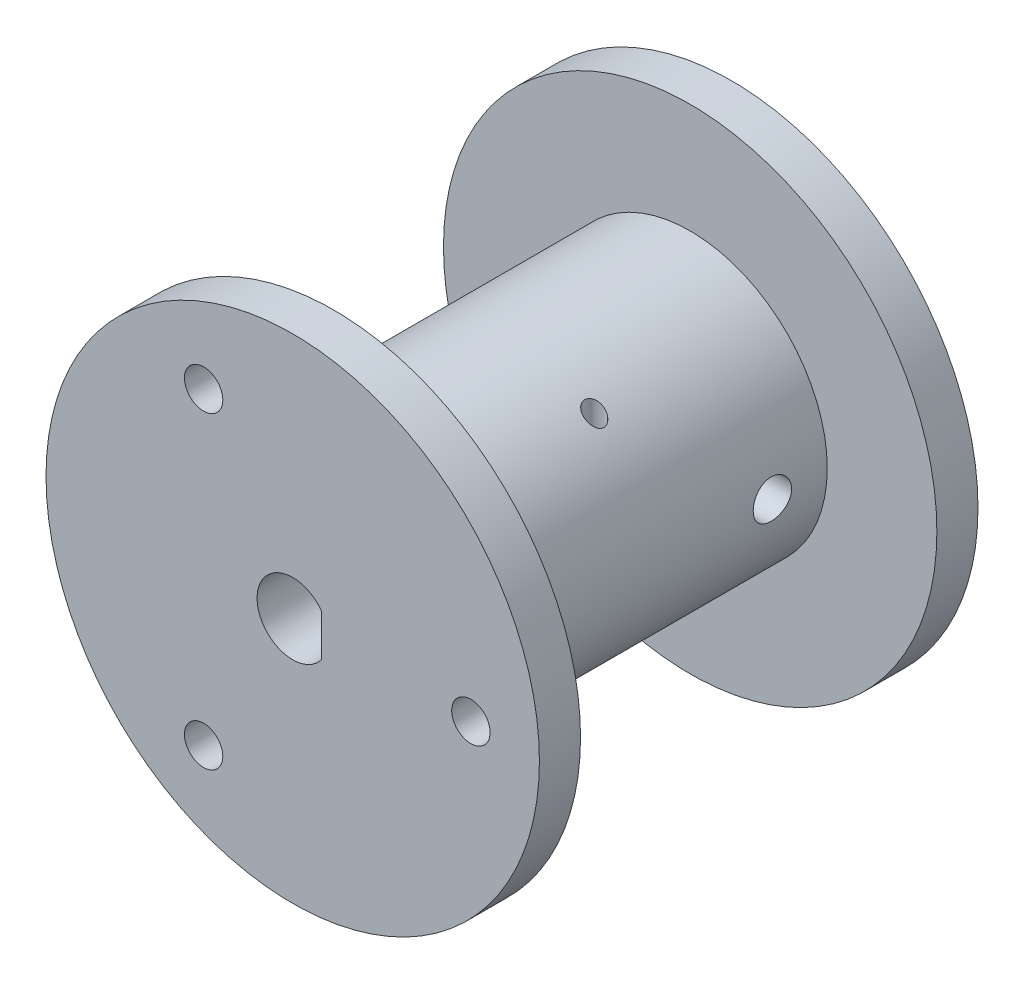
ISO-10303-21;
HEADER;
FILE_DESCRIPTION(('STEP AP214'),'2;1');
FILE_NAME('part.step','',(''),(''),'','','');
FILE_SCHEMA(('AUTOMOTIVE_DESIGN { 1 0 10303 214 1 1 1 1 }'));
ENDSEC;
DATA;
#1=APPLICATION_CONTEXT('core data for automotive mechanical design processes');
#2=APPLICATION_PROTOCOL_DEFINITION('international standard','automotive_design',2000,#1);
#3=PRODUCT_CONTEXT('',#1,'mechanical');
#4=PRODUCT('Part','Part','',(#3));
#5=PRODUCT_RELATED_PRODUCT_CATEGORY('part','',(#4));
#6=PRODUCT_DEFINITION_FORMATION('','',#4);
#7=PRODUCT_DEFINITION_CONTEXT('part definition',#1,'design');
#8=PRODUCT_DEFINITION('design','',#6,#7);
#9=PRODUCT_DEFINITION_SHAPE('','',#8);
#10=(LENGTH_UNIT() NAMED_UNIT(*) SI_UNIT(.MILLI.,.METRE.));
#11=(NAMED_UNIT(*) PLANE_ANGLE_UNIT() SI_UNIT($,.RADIAN.));
#12=(NAMED_UNIT(*) SI_UNIT($,.STERADIAN.) SOLID_ANGLE_UNIT());
#13=UNCERTAINTY_MEASURE_WITH_UNIT(LENGTH_MEASURE(1.E-05),#10,'distance_accuracy_value','');
#14=(GEOMETRIC_REPRESENTATION_CONTEXT(3) GLOBAL_UNCERTAINTY_ASSIGNED_CONTEXT((#13)) GLOBAL_UNIT_ASSIGNED_CONTEXT((#10,
#11,#12)) REPRESENTATION_CONTEXT('',''));
#15=CARTESIAN_POINT('',(0.,0.,0.));
#16=DIRECTION('',(0.,0.,1.));
#17=DIRECTION('',(1.,0.,0.));
#18=AXIS2_PLACEMENT_3D('',#15,#16,#17);
#19=CARTESIAN_POINT('',(0.,0.,0.));
#20=DIRECTION('',(0.,0.,-1.));
#21=DIRECTION('',(1.,0.,0.));
#22=AXIS2_PLACEMENT_3D('',#19,#20,#21);
#23=CYLINDRICAL_SURFACE('',#22,18.);
#24=CARTESIAN_POINT('',(0.,0.,0.));
#25=DIRECTION('',(0.,0.,1.));
#26=DIRECTION('',(1.,0.,0.));
#27=AXIS2_PLACEMENT_3D('',#24,#25,#26);
#28=CIRCLE('',#27,18.);
#29=CARTESIAN_POINT('',(18.,0.,0.));
#30=VERTEX_POINT('',#29);
#31=EDGE_CURVE('E24',#30,#30,#28,.T.);
#32=ORIENTED_EDGE('',*,*,#31,.T.);
#33=DIRECTION('',(0.,0.,1.));
#34=VECTOR('',#33,1.);
#35=CARTESIAN_POINT('',(18.,0.,0.));
#36=LINE('',#35,#34);
#37=CARTESIAN_POINT('',(18.,0.,3.));
#38=VERTEX_POINT('',#37);
#39=EDGE_CURVE('E10',#30,#38,#36,.T.);
#40=ORIENTED_EDGE('',*,*,#39,.T.);
#41=CARTESIAN_POINT('',(0.,0.,3.));
#42=DIRECTION('',(0.,0.,1.));
#43=DIRECTION('',(1.,0.,0.));
#44=AXIS2_PLACEMENT_3D('',#41,#42,#43);
#45=CIRCLE('',#44,18.);
#46=EDGE_CURVE('E242',#38,#38,#45,.T.);
#47=ORIENTED_EDGE('',*,*,#46,.F.);
#48=ORIENTED_EDGE('',*,*,#39,.F.);
#49=EDGE_LOOP('',(#32,#40,#47,#48));
#50=FACE_BOUND('',#49,.T.);
#51=ADVANCED_FACE('F16',(#50),#23,.T.);
#52=CARTESIAN_POINT('',(-6.5,11.258330249198,29.15));
#53=DIRECTION('',(0.,0.,1.));
#54=DIRECTION('',(1.,0.,0.));
#55=AXIS2_PLACEMENT_3D('',#52,#53,#54);
#56=PLANE('',#55);
#57=CARTESIAN_POINT('',(-6.5,11.258330249198,29.15));
#58=DIRECTION('',(0.,0.,1.));
#59=DIRECTION('',(1.,0.,0.));
#60=AXIS2_PLACEMENT_3D('',#57,#58,#59);
#61=CIRCLE('',#60,1.4);
#62=CARTESIAN_POINT('',(-5.1,11.258330249198,29.15));
#63=VERTEX_POINT('',#62);
#64=EDGE_CURVE('E236',#63,#63,#61,.T.);
#65=ORIENTED_EDGE('',*,*,#64,.T.);
#66=EDGE_LOOP('',(#65));
#67=FACE_BOUND('',#66,.T.);
#68=ADVANCED_FACE('F264',(#67),#56,.T.);
#69=CARTESIAN_POINT('',(13.,0.,29.15));
#70=DIRECTION('',(0.,0.,1.));
#71=DIRECTION('',(1.,0.,0.));
#72=AXIS2_PLACEMENT_3D('',#69,#70,#71);
#73=PLANE('',#72);
#74=CARTESIAN_POINT('',(13.,0.,29.15));
#75=DIRECTION('',(0.,0.,1.));
#76=DIRECTION('',(1.,0.,0.));
#77=AXIS2_PLACEMENT_3D('',#74,#75,#76);
#78=CIRCLE('',#77,1.4);
#79=CARTESIAN_POINT('',(14.4,0.,29.15));
#80=VERTEX_POINT('',#79);
#81=EDGE_CURVE('E232',#80,#80,#78,.T.);
#82=ORIENTED_EDGE('',*,*,#81,.T.);
#83=EDGE_LOOP('',(#82));
#84=FACE_BOUND('',#83,.T.);
#85=ADVANCED_FACE('F254',(#84),#73,.T.);
#86=CARTESIAN_POINT('',(0.,0.,0.));
#87=DIRECTION('',(0.,0.,1.));
#88=DIRECTION('',(1.,0.,0.));
#89=AXIS2_PLACEMENT_3D('',#86,#87,#88);
#90=PLANE('',#89);
#91=CARTESIAN_POINT('',(0.,0.,0.));
#92=DIRECTION('',(0.,0.,-1.));
#93=DIRECTION('',(1.,0.,0.));
#94=AXIS2_PLACEMENT_3D('',#91,#92,#93);
#95=CIRCLE('',#94,2.6);
#96=CARTESIAN_POINT('',(2.1,-1.532970971676,0.));
#97=VERTEX_POINT('',#96);
#98=CARTESIAN_POINT('',(2.1,1.532970971676,0.));
#99=VERTEX_POINT('',#98);
#100=EDGE_CURVE('E147',#97,#99,#95,.T.);
#101=ORIENTED_EDGE('',*,*,#100,.F.);
#102=DIRECTION('',(0.,1.,0.));
#103=VECTOR('',#102,1.);
#104=CARTESIAN_POINT('',(2.1,-1.3,0.));
#105=LINE('',#104,#103);
#106=EDGE_CURVE('E218',#97,#99,#105,.T.);
#107=ORIENTED_EDGE('',*,*,#106,.T.);
#108=EDGE_LOOP('',(#101,#107));
#109=FACE_BOUND('',#108,.T.);
#110=ORIENTED_EDGE('',*,*,#31,.F.);
#111=EDGE_LOOP('',(#110));
#112=FACE_BOUND('',#111,.T.);
#113=ADVANCED_FACE('F252',(#109,#112),#90,.F.);
#114=CARTESIAN_POINT('',(-6.5,-11.25833024919,29.15));
#115=DIRECTION('',(0.,0.,1.));
#116=DIRECTION('',(1.,0.,0.));
#117=AXIS2_PLACEMENT_3D('',#114,#115,#116);
#118=PLANE('',#117);
#119=CARTESIAN_POINT('',(-6.5,-11.25833024919,29.15));
#120=DIRECTION('',(0.,0.,1.));
#121=DIRECTION('',(1.,0.,0.));
#122=AXIS2_PLACEMENT_3D('',#119,#120,#121);
#123=CIRCLE('',#122,1.4);
#124=CARTESIAN_POINT('',(-5.1,-11.25833024919,29.15));
#125=VERTEX_POINT('',#124);
#126=EDGE_CURVE('E215',#125,#125,#123,.T.);
#127=ORIENTED_EDGE('',*,*,#126,.T.);
#128=EDGE_LOOP('',(#127));
#129=FACE_BOUND('',#128,.T.);
#130=ADVANCED_FACE('F255',(#129),#118,.T.);
#131=CARTESIAN_POINT('',(6.,20.,16.));
#132=DIRECTION('',(0.,1.,0.));
#133=DIRECTION('',(1.,0.,0.));
#134=AXIS2_PLACEMENT_3D('',#131,#132,#133);
#135=CYLINDRICAL_SURFACE('',#134,0.7);
#136=CARTESIAN_POINT('',(6.7,7.423610981187,16.));
#137=CARTESIAN_POINT('',(6.7,7.423610981187,16.061420163176));
#138=CARTESIAN_POINT('',(6.693532975308,7.429447600473,16.122754671505));
#139=CARTESIAN_POINT('',(6.680632709645,7.441090597171,16.183098192978));
#140=CARTESIAN_POINT('',(6.661520256542,7.458262973313,16.24155588298));
#141=CARTESIAN_POINT('',(6.636601886671,7.480449371539,16.297273795192));
#142=CARTESIAN_POINT('',(6.595796443133,7.516360339853,16.368085013772));
#143=CARTESIAN_POINT('',(6.584424511656,7.526335762921,16.386239650214));
#144=CARTESIAN_POINT('',(6.572411678957,7.53683522499,16.403938417637));
#145=CARTESIAN_POINT('',(6.559781217614,7.547830749187,16.421155499173));
#146=CARTESIAN_POINT('',(6.546556959473,7.559293875357,16.437867222008));
#147=CARTESIAN_POINT('',(6.501960020964,7.597774091174,16.490195168881));
#148=CARTESIAN_POINT('',(6.46832721929,7.626531666773,16.523698047556));
#149=CARTESIAN_POINT('',(6.432123449108,7.657158813957,16.554339959049));
#150=CARTESIAN_POINT('',(6.393617223354,7.689342566472,16.581920111358));
#151=CARTESIAN_POINT('',(6.353091890638,7.722770795535,16.606257993675));
#152=CARTESIAN_POINT('',(6.258811586842,7.799472927624,16.652985313187));
#153=CARTESIAN_POINT('',(6.20411790761,7.843273272387,16.673638278514));
#154=CARTESIAN_POINT('',(6.147355183932,7.887943549649,16.688823903646));
#155=CARTESIAN_POINT('',(6.089143902674,7.932913952525,16.698287434595));
#156=CARTESIAN_POINT('',(6.030139770779,7.977646487715,16.701848317146));
#157=CARTESIAN_POINT('',(5.91087005233,8.066426752755,16.696908731573));
#158=CARTESIAN_POINT('',(5.850590582323,8.110455682424,16.688190677623));
#159=CARTESIAN_POINT('',(5.791081437799,8.153082869391,16.673140201952));
#160=CARTESIAN_POINT('',(5.733238053439,8.193743142968,16.651837184436));
#161=CARTESIAN_POINT('',(5.677927203744,8.231955757717,16.624540370653));
#162=CARTESIAN_POINT('',(5.577504946575,8.300293496152,16.561054925864));
#163=CARTESIAN_POINT('',(5.532003137056,8.330759241346,16.525627389309));
#164=CARTESIAN_POINT('',(5.490076266743,8.358416380811,16.485764177875));
#165=CARTESIAN_POINT('',(5.452291438685,8.383027386573,16.44195216543));
#166=CARTESIAN_POINT('',(5.419118280647,8.404420250563,16.394785949125));
#167=CARTESIAN_POINT('',(5.36129132756,8.441432989465,16.292678361777));
#168=CARTESIAN_POINT('',(5.33712915028,8.456721903805,16.23745857878));
#169=CARTESIAN_POINT('',(5.318744644311,8.468260971439,16.17997836171));
#170=CARTESIAN_POINT('',(5.306370909869,8.475994277313,16.120973813692));
#171=CARTESIAN_POINT('',(5.300126506963,8.479897347958,16.061211317834));
#172=CARTESIAN_POINT('',(5.299916523227,8.480028588211,15.960824351901));
#173=CARTESIAN_POINT('',(5.302662862186,8.47831208954,15.920174360154));
#174=CARTESIAN_POINT('',(5.308241963266,8.47482539965,15.87975351697));
#175=CARTESIAN_POINT('',(5.316630550833,8.46957309751,15.839798604194));
#176=CARTESIAN_POINT('',(5.327781638656,8.462565271847,15.800542407666));
#177=CARTESIAN_POINT('',(5.348599341269,8.449411407784,15.742903432129));
#178=CARTESIAN_POINT('',(5.356256004786,8.444563830289,15.723830876313));
#179=CARTESIAN_POINT('',(5.364586161912,8.439277434952,15.705024505533));
#180=CARTESIAN_POINT('',(5.37357854278,8.433555290088,15.686513974385));
#181=CARTESIAN_POINT('',(5.383219946253,8.427401254546,15.668328633745));
#182=CARTESIAN_POINT('',(5.421832205693,8.402670285586,15.601323329893));
#183=CARTESIAN_POINT('',(5.455012481143,8.381257029193,15.554804335829));
#184=CARTESIAN_POINT('',(5.492698816365,8.356691629017,15.511609025122));
#185=CARTESIAN_POINT('',(5.534430085028,8.329144046304,15.472313228275));
#186=CARTESIAN_POINT('',(5.579651521336,8.298847750574,15.437388068836));
#187=CARTESIAN_POINT('',(5.662585482144,8.242384495224,15.385309871925));
#188=CARTESIAN_POINT('',(5.698917998809,8.217390657414,15.365921049236));
#189=CARTESIAN_POINT('',(5.736500157893,8.191243269006,15.349154633775));
#190=CARTESIAN_POINT('',(5.775073989581,8.16408094826,15.335107466314));
#191=CARTESIAN_POINT('',(5.814371790981,8.136060754353,15.323838787263));
#192=CARTESIAN_POINT('',(5.931768447205,8.051291543394,15.29882445447));
#193=CARTESIAN_POINT('',(6.010993571128,7.992727375067,15.292990488834));
#194=CARTESIAN_POINT('',(6.090088070553,7.932754295285,15.297873697529));
#195=CARTESIAN_POINT('',(6.167391253484,7.872608031572,15.313195901262));
#196=CARTESIAN_POINT('',(6.241346146774,7.813677462955,15.338400572407));
#197=CARTESIAN_POINT('',(6.352184245195,7.723511933627,15.393266956371));
#198=CARTESIAN_POINT('',(6.392158095265,7.690547999272,15.417183943095));
#199=CARTESIAN_POINT('',(6.43017645922,7.658787058651,15.444252795814));
#200=CARTESIAN_POINT('',(6.465968124576,7.628527498068,15.474301287601));
#201=CARTESIAN_POINT('',(6.499275765808,7.600068704935,15.507138139574));
#202=CARTESIAN_POINT('',(6.543922714996,7.561575278007,15.558851812687));
#203=CARTESIAN_POINT('',(6.557413401678,7.549889225285,15.575693913783));
#204=CARTESIAN_POINT('',(6.570298101718,7.538679103142,15.59305743974));
#205=CARTESIAN_POINT('',(6.582552014467,7.527974507574,15.610917990655));
#206=CARTESIAN_POINT('',(6.594150908199,7.517804555788,15.629248931725));
#207=CARTESIAN_POINT('',(6.635614063146,7.481328814013,15.700526438729));
#208=CARTESIAN_POINT('',(6.66091413908,7.458807533322,15.756597917506));
#209=CARTESIAN_POINT('',(6.680325568549,7.441367808296,15.81547174188));
#210=CARTESIAN_POINT('',(6.693430112146,7.429540434902,15.876275215474));
#211=CARTESIAN_POINT('',(6.7,7.423610981187,15.938093293157));
#212=CARTESIAN_POINT('',(6.7,7.423610981187,16.));
#213=(BOUNDED_CURVE() B_SPLINE_CURVE(6,(#136,#137,#138,#139,#140,#141,#142,#143,#144,#145,#146,
#147,#148,#149,#150,#151,#152,#153,#154,#155,#156,#157,#158,#159,#160,#161,#162,#163,#164,#165,
#166,#167,#168,#169,#170,#171,#172,#173,#174,#175,#176,#177,#178,#179,#180,#181,#182,#183,#184,
#185,#186,#187,#188,#189,#190,#191,#192,#193,#194,#195,#196,#197,#198,#199,#200,#201,#202,#203,
#204,#205,#206,#207,#208,#209,#210,#211,#212),.UNSPECIFIED.,.T.,
.F.) B_SPLINE_CURVE_WITH_KNOTS((7,5,5,5,5,5,5,5,5,5,5,5,5,5,5,7),(0.,0.08286151673284,
0.112342981733,0.178179417654,0.259286098524,0.341845266376,0.418789774287,0.499511354963,
0.554418021429,0.582077179904,0.658354963559,0.713613191653,0.821552318296,0.886504016402,
0.91639562001,1.),
.UNSPECIFIED.) CURVE() GEOMETRIC_REPRESENTATION_ITEM() RATIONAL_B_SPLINE_CURVE((1.,1.,1.,1.,1.,
1.,1.,1.,1.,1.,1.,1.,1.,1.,1.,1.,1.,1.,1.,1.,1.,1.,1.,1.,1.,1.,1.,1.,1.,1.,1.,1.,1.,1.,1.,1.,1.,
1.,1.,1.,1.,1.,1.,1.,1.,1.,1.,1.,1.,1.,1.,1.,1.,1.,1.,1.,1.,1.,1.,1.,1.,1.,1.,1.,1.,1.,1.,1.,1.,
1.,1.,1.,1.,1.,1.,1.,1.)) REPRESENTATION_ITEM(''));
#214=CARTESIAN_POINT('',(6.7,7.423610981187,16.));
#215=VERTEX_POINT('',#214);
#216=EDGE_CURVE('E138',#215,#215,#213,.T.);
#217=ORIENTED_EDGE('',*,*,#216,.F.);
#218=DIRECTION('',(0.,-1.,0.));
#219=VECTOR('',#218,1.);
#220=CARTESIAN_POINT('',(6.7,20.,16.));
#221=LINE('',#220,#219);
#222=CARTESIAN_POINT('',(6.7,-7.423610981187,16.));
#223=VERTEX_POINT('',#222);
#224=EDGE_CURVE('E246',#215,#223,#221,.T.);
#225=ORIENTED_EDGE('',*,*,#224,.T.);
#226=CARTESIAN_POINT('',(6.7,-7.423610981187,16.));
#227=CARTESIAN_POINT('',(6.7,-7.423610981187,16.061420163176));
#228=CARTESIAN_POINT('',(6.693532975308,-7.429447600473,16.122754671505));
#229=CARTESIAN_POINT('',(6.680632709645,-7.441090597171,16.183098192978));
#230=CARTESIAN_POINT('',(6.661520256542,-7.458262973313,16.24155588298));
#231=CARTESIAN_POINT('',(6.636601886671,-7.480449371539,16.297273795192));
#232=CARTESIAN_POINT('',(6.595796443133,-7.516360339853,16.368085013772));
#233=CARTESIAN_POINT('',(6.584424511656,-7.526335762921,16.386239650214));
#234=CARTESIAN_POINT('',(6.572411678957,-7.53683522499,16.403938417637));
#235=CARTESIAN_POINT('',(6.559781217614,-7.547830749187,16.421155499173));
#236=CARTESIAN_POINT('',(6.546556959473,-7.559293875357,16.437867222008));
#237=CARTESIAN_POINT('',(6.501960020964,-7.597774091174,16.490195168881));
#238=CARTESIAN_POINT('',(6.46832721929,-7.626531666773,16.523698047556));
#239=CARTESIAN_POINT('',(6.432123449108,-7.657158813957,16.554339959049));
#240=CARTESIAN_POINT('',(6.393617223354,-7.689342566472,16.581920111358));
#241=CARTESIAN_POINT('',(6.353091890638,-7.722770795535,16.606257993675));
#242=CARTESIAN_POINT('',(6.258811586842,-7.799472927624,16.652985313187));
#243=CARTESIAN_POINT('',(6.20411790761,-7.843273272387,16.673638278514));
#244=CARTESIAN_POINT('',(6.147355183932,-7.887943549649,16.688823903646));
#245=CARTESIAN_POINT('',(6.089143902674,-7.932913952525,16.698287434595));
#246=CARTESIAN_POINT('',(6.030139770779,-7.977646487715,16.701848317146));
#247=CARTESIAN_POINT('',(5.91087005233,-8.066426752755,16.696908731573));
#248=CARTESIAN_POINT('',(5.850590582323,-8.110455682424,16.688190677623));
#249=CARTESIAN_POINT('',(5.791081437799,-8.153082869391,16.673140201952));
#250=CARTESIAN_POINT('',(5.733238053439,-8.193743142968,16.651837184436));
#251=CARTESIAN_POINT('',(5.677927203744,-8.231955757717,16.624540370653));
#252=CARTESIAN_POINT('',(5.577504946575,-8.300293496152,16.561054925864));
#253=CARTESIAN_POINT('',(5.532003137056,-8.330759241346,16.525627389309));
#254=CARTESIAN_POINT('',(5.490076266743,-8.358416380811,16.485764177875));
#255=CARTESIAN_POINT('',(5.452291438685,-8.383027386573,16.44195216543));
#256=CARTESIAN_POINT('',(5.419118280647,-8.404420250563,16.394785949125));
#257=CARTESIAN_POINT('',(5.36129132756,-8.441432989465,16.292678361777));
#258=CARTESIAN_POINT('',(5.33712915028,-8.456721903805,16.23745857878));
#259=CARTESIAN_POINT('',(5.318744644311,-8.468260971439,16.17997836171));
#260=CARTESIAN_POINT('',(5.306370909869,-8.475994277313,16.120973813692));
#261=CARTESIAN_POINT('',(5.300126506963,-8.479897347958,16.061211317834));
#262=CARTESIAN_POINT('',(5.299916523227,-8.480028588211,15.960824351901));
#263=CARTESIAN_POINT('',(5.302662862186,-8.47831208954,15.920174360154));
#264=CARTESIAN_POINT('',(5.308241963266,-8.47482539965,15.87975351697));
#265=CARTESIAN_POINT('',(5.316630550833,-8.46957309751,15.839798604194));
#266=CARTESIAN_POINT('',(5.327781638656,-8.462565271847,15.800542407666));
#267=CARTESIAN_POINT('',(5.348599341269,-8.449411407784,15.742903432129));
#268=CARTESIAN_POINT('',(5.356256004786,-8.444563830289,15.723830876313));
#269=CARTESIAN_POINT('',(5.364586161912,-8.439277434952,15.705024505533));
#270=CARTESIAN_POINT('',(5.37357854278,-8.433555290088,15.686513974385));
#271=CARTESIAN_POINT('',(5.383219946253,-8.427401254546,15.668328633745));
#272=CARTESIAN_POINT('',(5.421832205693,-8.402670285586,15.601323329893));
#273=CARTESIAN_POINT('',(5.455012481143,-8.381257029193,15.554804335829));
#274=CARTESIAN_POINT('',(5.492698816365,-8.356691629017,15.511609025122));
#275=CARTESIAN_POINT('',(5.534430085028,-8.329144046304,15.472313228275));
#276=CARTESIAN_POINT('',(5.579651521336,-8.298847750574,15.437388068836));
#277=CARTESIAN_POINT('',(5.662585482144,-8.242384495224,15.385309871925));
#278=CARTESIAN_POINT('',(5.698917998809,-8.217390657414,15.365921049236));
#279=CARTESIAN_POINT('',(5.736500157893,-8.191243269006,15.349154633775));
#280=CARTESIAN_POINT('',(5.775073989581,-8.16408094826,15.335107466314));
#281=CARTESIAN_POINT('',(5.814371790981,-8.136060754353,15.323838787263));
#282=CARTESIAN_POINT('',(5.931768447205,-8.051291543394,15.29882445447));
#283=CARTESIAN_POINT('',(6.010993571128,-7.992727375068,15.292990488834));
#284=CARTESIAN_POINT('',(6.090088070553,-7.932754295284,15.297873697529));
#285=CARTESIAN_POINT('',(6.167391253484,-7.872608031572,15.313195901261));
#286=CARTESIAN_POINT('',(6.241346146774,-7.813677462955,15.338400572407));
#287=CARTESIAN_POINT('',(6.352184245195,-7.723511933627,15.393266956371));
#288=CARTESIAN_POINT('',(6.392158095265,-7.690547999272,15.417183943095));
#289=CARTESIAN_POINT('',(6.43017645922,-7.658787058651,15.444252795814));
#290=CARTESIAN_POINT('',(6.465968124576,-7.628527498068,15.474301287601));
#291=CARTESIAN_POINT('',(6.499275765807,-7.600068704935,15.507138139574));
#292=CARTESIAN_POINT('',(6.543922714996,-7.561575278007,15.558851812687));
#293=CARTESIAN_POINT('',(6.557413401678,-7.549889225285,15.575693913783));
#294=CARTESIAN_POINT('',(6.570298101718,-7.538679103142,15.59305743974));
#295=CARTESIAN_POINT('',(6.582552014467,-7.527974507574,15.610917990655));
#296=CARTESIAN_POINT('',(6.594150908199,-7.517804555788,15.629248931725));
#297=CARTESIAN_POINT('',(6.635614063147,-7.481328814013,15.700526438729));
#298=CARTESIAN_POINT('',(6.66091413908,-7.458807533322,15.756597917506));
#299=CARTESIAN_POINT('',(6.68032556855,-7.441367808296,15.81547174188));
#300=CARTESIAN_POINT('',(6.693430112146,-7.429540434902,15.876275215473));
#301=CARTESIAN_POINT('',(6.7,-7.423610981187,15.938093293157));
#302=CARTESIAN_POINT('',(6.7,-7.423610981187,16.));
#303=(BOUNDED_CURVE() B_SPLINE_CURVE(6,(#226,#227,#228,#229,#230,#231,#232,#233,#234,#235,#236,
#237,#238,#239,#240,#241,#242,#243,#244,#245,#246,#247,#248,#249,#250,#251,#252,#253,#254,#255,
#256,#257,#258,#259,#260,#261,#262,#263,#264,#265,#266,#267,#268,#269,#270,#271,#272,#273,#274,
#275,#276,#277,#278,#279,#280,#281,#282,#283,#284,#285,#286,#287,#288,#289,#290,#291,#292,#293,
#294,#295,#296,#297,#298,#299,#300,#301,#302),.UNSPECIFIED.,.T.,
.F.) B_SPLINE_CURVE_WITH_KNOTS((7,5,5,5,5,5,5,5,5,5,5,5,5,5,5,7),(0.,0.08286151673284,
0.112342981733,0.178179417654,0.259286098524,0.341845266376,0.418789774287,0.499511354963,
0.554418021429,0.582077179904,0.658354963559,0.713613191653,0.821552318295,0.886504016402,
0.91639562001,1.),
.UNSPECIFIED.) CURVE() GEOMETRIC_REPRESENTATION_ITEM() RATIONAL_B_SPLINE_CURVE((1.,1.,1.,1.,1.,
1.,1.,1.,1.,1.,1.,1.,1.,1.,1.,1.,1.,1.,1.,1.,1.,1.,1.,1.,1.,1.,1.,1.,1.,1.,1.,1.,1.,1.,1.,1.,1.,
1.,1.,1.,1.,1.,1.,1.,1.,1.,1.,1.,1.,1.,1.,1.,1.,1.,1.,1.,1.,1.,1.,1.,1.,1.,1.,1.,1.,1.,1.,1.,1.,
1.,1.,1.,1.,1.,1.,1.,1.)) REPRESENTATION_ITEM(''));
#304=EDGE_CURVE('E199',#223,#223,#303,.T.);
#305=ORIENTED_EDGE('',*,*,#304,.T.);
#306=ORIENTED_EDGE('',*,*,#224,.F.);
#307=EDGE_LOOP('',(#217,#225,#305,#306));
#308=FACE_BOUND('',#307,.T.);
#309=ADVANCED_FACE('F263',(#308),#135,.F.);
#310=CARTESIAN_POINT('',(0.,0.,3.));
#311=DIRECTION('',(0.,0.,1.));
#312=DIRECTION('',(1.,0.,0.));
#313=AXIS2_PLACEMENT_3D('',#310,#311,#312);
#314=PLANE('',#313);
#315=CARTESIAN_POINT('',(0.,0.,3.));
#316=DIRECTION('',(0.,0.,1.));
#317=DIRECTION('',(1.,0.,0.));
#318=AXIS2_PLACEMENT_3D('',#315,#316,#317);
#319=CIRCLE('',#318,10.);
#320=CARTESIAN_POINT('',(10.,0.,3.));
#321=VERTEX_POINT('',#320);
#322=EDGE_CURVE('E142',#321,#321,#319,.T.);
#323=ORIENTED_EDGE('',*,*,#322,.F.);
#324=EDGE_LOOP('',(#323));
#325=FACE_BOUND('',#324,.T.);
#326=ORIENTED_EDGE('',*,*,#46,.T.);
#327=EDGE_LOOP('',(#326));
#328=FACE_BOUND('',#327,.T.);
#329=ADVANCED_FACE('F281',(#325,#328),#314,.T.);
#330=CARTESIAN_POINT('',(1.5,0.,7.));
#331=DIRECTION('',(-1.,0.,0.));
#332=DIRECTION('',(0.,1.,0.));
#333=AXIS2_PLACEMENT_3D('',#330,#331,#332);
#334=CYLINDRICAL_SURFACE('',#333,1.4);
#335=CARTESIAN_POINT('',(2.1,0.,7.));
#336=DIRECTION('',(-1.,0.,0.));
#337=DIRECTION('',(0.,1.,0.));
#338=AXIS2_PLACEMENT_3D('',#335,#336,#337);
#339=CIRCLE('',#338,1.4);
#340=CARTESIAN_POINT('',(2.1,1.4,7.));
#341=VERTEX_POINT('',#340);
#342=EDGE_CURVE('E148',#341,#341,#339,.T.);
#343=ORIENTED_EDGE('',*,*,#342,.T.);
#344=DIRECTION('',(1.,0.,0.));
#345=VECTOR('',#344,1.);
#346=CARTESIAN_POINT('',(1.5,1.4,7.));
#347=LINE('',#346,#345);
#348=CARTESIAN_POINT('',(9.901515035589,1.4,7.));
#349=VERTEX_POINT('',#348);
#350=EDGE_CURVE('E239',#341,#349,#347,.T.);
#351=ORIENTED_EDGE('',*,*,#350,.T.);
#352=CARTESIAN_POINT('',(9.901515035589,1.4,7.));
#353=CARTESIAN_POINT('',(9.901515035589,1.4,7.134298040237));
#354=CARTESIAN_POINT('',(9.903640130875,1.384970160413,7.268589139922));
#355=CARTESIAN_POINT('',(9.907890140904,1.354912335546,7.401660688283));
#356=CARTESIAN_POINT('',(9.914145916786,1.309630366842,7.532236162476));
#357=CARTESIAN_POINT('',(9.922162754959,1.248786389021,7.65884807891));
#358=CARTESIAN_POINT('',(9.931531765376,1.171952055942,7.779693624638));
#359=CARTESIAN_POINT('',(9.948179730155,1.018521665372,7.965159107079));
#360=CARTESIAN_POINT('',(9.955038071414,0.951348878908,8.034697429937));
#361=CARTESIAN_POINT('',(9.962042494822,0.877220953455,8.100112730271));
#362=CARTESIAN_POINT('',(9.968971917954,0.796263869732,8.160484738731));
#363=CARTESIAN_POINT('',(9.975572533991,0.708712220674,8.214865717801));
#364=CARTESIAN_POINT('',(9.981573511395,0.614919371267,8.262274427594));
#365=CARTESIAN_POINT('',(9.990223321868,0.4473069353,8.328636885616));
#366=CARTESIAN_POINT('',(9.993330588733,0.376585741878,8.351833805127));
#367=CARTESIAN_POINT('',(9.995933260826,0.303648928901,8.370847982723));
#368=CARTESIAN_POINT('',(9.997948600515,0.228986458656,8.385349327532));
#369=CARTESIAN_POINT('',(9.999315553896,0.153124780768,8.395108850329));
#370=CARTESIAN_POINT('',(10.,0.07661149265728,8.4));
#371=CARTESIAN_POINT('',(10.,0.,8.4));
#372=(BOUNDED_CURVE() B_SPLINE_CURVE(7,(#352,#353,#354,#355,#356,#357,#358,#359,#360,#361,#362,
#363,#364,#365,#366,#367,#368,#369,#370,#371),.UNSPECIFIED.,.F.,
.F.) B_SPLINE_CURVE_WITH_KNOTS((8,6,6,8),(0.,0.479122703375,0.788471642168,1.),
.UNSPECIFIED.) CURVE() GEOMETRIC_REPRESENTATION_ITEM() RATIONAL_B_SPLINE_CURVE((1.,1.,1.,1.,1.,
1.,1.,1.,1.,1.,1.,1.,1.,1.,1.,1.,1.,1.,1.,1.)) REPRESENTATION_ITEM(''));
#373=CARTESIAN_POINT('',(10.,0.,8.4));
#374=VERTEX_POINT('',#373);
#375=EDGE_CURVE('E163',#349,#374,#372,.T.);
#376=ORIENTED_EDGE('',*,*,#375,.T.);
#377=CARTESIAN_POINT('',(10.,0.,8.4));
#378=CARTESIAN_POINT('',(10.,-0.190635546012,8.4));
#379=CARTESIAN_POINT('',(9.99575997734,-0.376798379062,8.369715303774));
#380=CARTESIAN_POINT('',(9.987639043286,-0.552869533634,8.311702258982));
#381=CARTESIAN_POINT('',(9.976717520861,-0.714070276914,8.22966289985));
#382=CARTESIAN_POINT('',(9.96454544228,-0.856667749464,8.128392867031));
#383=CARTESIAN_POINT('',(9.952538717575,-0.978348518018,8.013720100293));
#384=CARTESIAN_POINT('',(9.931532089328,-1.171949070345,7.779697233605));
#385=CARTESIAN_POINT('',(9.922163217262,-1.24878272688,7.658854300596));
#386=CARTESIAN_POINT('',(9.914146162441,-1.309628935861,7.53224162339));
#387=CARTESIAN_POINT('',(9.90788989437,-1.354914097307,7.401660600399));
#388=CARTESIAN_POINT('',(9.903639753547,-1.384972827377,7.268580838195));
#389=CARTESIAN_POINT('',(9.901515035589,-1.4,7.134286087082));
#390=CARTESIAN_POINT('',(9.901515035589,-1.4,6.865701959763));
#391=CARTESIAN_POINT('',(9.903640130875,-1.384970160413,6.731410860078));
#392=CARTESIAN_POINT('',(9.907890140904,-1.354912335546,6.598339311717));
#393=CARTESIAN_POINT('',(9.914145916786,-1.309630366842,6.467763837523));
#394=CARTESIAN_POINT('',(9.922162754959,-1.248786389021,6.34115192109));
#395=CARTESIAN_POINT('',(9.931531765376,-1.171952055942,6.220306375362));
#396=CARTESIAN_POINT('',(9.952534945479,-0.978383282275,5.986321922475));
#397=CARTESIAN_POINT('',(9.964542600623,-0.85670155308,5.871625510799));
#398=CARTESIAN_POINT('',(9.97671905319,-0.714067881061,5.770319197342));
#399=CARTESIAN_POINT('',(9.987644027642,-0.552815610009,5.688262221335));
#400=CARTESIAN_POINT('',(9.995763498341,-0.376708006593,5.630259538256));
#401=CARTESIAN_POINT('',(10.,-0.190556349915,5.6));
#402=CARTESIAN_POINT('',(10.,0.,5.6));
#403=(BOUNDED_CURVE() B_SPLINE_CURVE(7,(#377,#378,#379,#380,#381,#382,#383,#384,#385,#386,#387,
#388,#389,#390,#391,#392,#393,#394,#395,#396,#397,#398,#399,#400,#401,#402),.UNSPECIFIED.,.F.,
.F.) B_SPLINE_CURVE_WITH_KNOTS((8,6,6,6,8),(0.,0.259233249005,0.500026793407,0.740841771471,1.),
.UNSPECIFIED.) CURVE() GEOMETRIC_REPRESENTATION_ITEM() RATIONAL_B_SPLINE_CURVE((1.,1.,1.,1.,1.,
1.,1.,1.,1.,1.,1.,1.,1.,1.,1.,1.,1.,1.,1.,1.,1.,1.,1.,1.,1.,1.)) REPRESENTATION_ITEM(''));
#404=CARTESIAN_POINT('',(10.,0.,5.6));
#405=VERTEX_POINT('',#404);
#406=EDGE_CURVE('E171',#374,#405,#403,.T.);
#407=ORIENTED_EDGE('',*,*,#406,.T.);
#408=CARTESIAN_POINT('',(10.,0.,5.6));
#409=CARTESIAN_POINT('',(10.,0.167747739612,5.6));
#410=CARTESIAN_POINT('',(9.996717003785,0.332690941998,5.623449316446));
#411=CARTESIAN_POINT('',(9.990349183427,0.490676962249,5.668937276187));
#412=CARTESIAN_POINT('',(9.981567826941,0.637973209536,5.734077348231));
#413=CARTESIAN_POINT('',(9.971407440037,0.77150280057,5.815565663907));
#414=CARTESIAN_POINT('',(9.960910095179,0.889121466665,5.909222479342));
#415=CARTESIAN_POINT('',(9.939012447563,1.109234564399,6.129335577076));
#416=CARTESIAN_POINT('',(9.927557193253,1.207446233009,6.261084542583));
#417=CARTESIAN_POINT('',(9.917530549097,1.28505205314,6.401412606408));
#418=CARTESIAN_POINT('',(9.909618525285,1.342689239539,6.547512855013));
#419=CARTESIAN_POINT('',(9.904216270258,1.380895184279,6.697185455819));
#420=CARTESIAN_POINT('',(9.901515035589,1.4,6.848586087001));
#421=CARTESIAN_POINT('',(9.901515035589,1.4,7.));
#422=(BOUNDED_CURVE() B_SPLINE_CURVE(7,(#408,#409,#410,#411,#412,#413,#414,#415,#416,#417,#418,
#419,#420,#421),.UNSPECIFIED.,.F.,.F.) B_SPLINE_CURVE_WITH_KNOTS((8,6,8),(0.,0.4580737268,1.),
.UNSPECIFIED.) CURVE() GEOMETRIC_REPRESENTATION_ITEM() RATIONAL_B_SPLINE_CURVE((1.,1.,1.,1.,1.,
1.,1.,1.,1.,1.,1.,1.,1.,1.)) REPRESENTATION_ITEM(''));
#423=EDGE_CURVE('E166',#405,#349,#422,.T.);
#424=ORIENTED_EDGE('',*,*,#423,.T.);
#425=ORIENTED_EDGE('',*,*,#350,.F.);
#426=EDGE_LOOP('',(#343,#351,#376,#407,#424,#425));
#427=FACE_BOUND('',#426,.T.);
#428=ADVANCED_FACE('F284',(#427),#334,.F.);
#429=CARTESIAN_POINT('',(-6.5,11.258330249198,29.15));
#430=DIRECTION('',(0.,0.,-1.));
#431=DIRECTION('',(1.,0.,0.));
#432=AXIS2_PLACEMENT_3D('',#429,#430,#431);
#433=CYLINDRICAL_SURFACE('',#432,1.4);
#434=DIRECTION('',(0.,0.,1.));
#435=VECTOR('',#434,1.);
#436=CARTESIAN_POINT('',(-5.1,11.258330249198,29.15));
#437=LINE('',#436,#435);
#438=CARTESIAN_POINT('',(-5.1,11.258330249198,32.));
#439=VERTEX_POINT('',#438);
#440=EDGE_CURVE('E231',#63,#439,#437,.T.);
#441=ORIENTED_EDGE('',*,*,#440,.T.);
#442=CARTESIAN_POINT('',(-6.5,11.258330249198,32.));
#443=DIRECTION('',(0.,0.,1.));
#444=DIRECTION('',(1.,0.,0.));
#445=AXIS2_PLACEMENT_3D('',#442,#443,#444);
#446=CIRCLE('',#445,1.4);
#447=EDGE_CURVE('E178',#439,#439,#446,.T.);
#448=ORIENTED_EDGE('',*,*,#447,.T.);
#449=ORIENTED_EDGE('',*,*,#440,.F.);
#450=ORIENTED_EDGE('',*,*,#64,.F.);
#451=EDGE_LOOP('',(#441,#448,#449,#450));
#452=FACE_BOUND('',#451,.T.);
#453=ADVANCED_FACE('F287',(#452),#433,.F.);
#454=CARTESIAN_POINT('',(13.,0.,29.15));
#455=DIRECTION('',(0.,0.,-1.));
#456=DIRECTION('',(1.,0.,0.));
#457=AXIS2_PLACEMENT_3D('',#454,#455,#456);
#458=CYLINDRICAL_SURFACE('',#457,1.4);
#459=DIRECTION('',(0.,0.,1.));
#460=VECTOR('',#459,1.);
#461=CARTESIAN_POINT('',(14.4,0.,29.15));
#462=LINE('',#461,#460);
#463=CARTESIAN_POINT('',(14.4,0.,32.));
#464=VERTEX_POINT('',#463);
#465=EDGE_CURVE('E229',#80,#464,#462,.T.);
#466=ORIENTED_EDGE('',*,*,#465,.T.);
#467=CARTESIAN_POINT('',(13.,0.,32.));
#468=DIRECTION('',(0.,0.,1.));
#469=DIRECTION('',(1.,0.,0.));
#470=AXIS2_PLACEMENT_3D('',#467,#468,#469);
#471=CIRCLE('',#470,1.4);
#472=EDGE_CURVE('E185',#464,#464,#471,.T.);
#473=ORIENTED_EDGE('',*,*,#472,.T.);
#474=ORIENTED_EDGE('',*,*,#465,.F.);
#475=ORIENTED_EDGE('',*,*,#81,.F.);
#476=EDGE_LOOP('',(#466,#473,#474,#475));
#477=FACE_BOUND('',#476,.T.);
#478=ADVANCED_FACE('F295',(#477),#458,.F.);
#479=CARTESIAN_POINT('',(0.,0.,-32.));
#480=DIRECTION('',(0.,0.,-1.));
#481=DIRECTION('',(1.,0.,0.));
#482=AXIS2_PLACEMENT_3D('',#479,#480,#481);
#483=CYLINDRICAL_SURFACE('',#482,2.6);
#484=ORIENTED_EDGE('',*,*,#100,.T.);
#485=DIRECTION('',(0.,0.,-1.));
#486=VECTOR('',#485,1.);
#487=CARTESIAN_POINT('',(2.1,1.532970971676,-32.));
#488=LINE('',#487,#486);
#489=CARTESIAN_POINT('',(2.1,1.532970971676,32.));
#490=VERTEX_POINT('',#489);
#491=EDGE_CURVE('E214',#490,#99,#488,.T.);
#492=ORIENTED_EDGE('',*,*,#491,.F.);
#493=CARTESIAN_POINT('',(0.,0.,32.));
#494=DIRECTION('',(0.,0.,-1.));
#495=DIRECTION('',(0.807692307692309,-0.589604219875225,0.));
#496=AXIS2_PLACEMENT_3D('',#493,#494,#495);
#497=CIRCLE('',#496,2.6);
#498=CARTESIAN_POINT('',(2.1,-1.532970971676,32.));
#499=VERTEX_POINT('',#498);
#500=EDGE_CURVE('E162',#499,#490,#497,.T.);
#501=ORIENTED_EDGE('',*,*,#500,.F.);
#502=DIRECTION('',(0.,0.,-1.));
#503=VECTOR('',#502,1.);
#504=CARTESIAN_POINT('',(2.1,-1.532970971676,-32.));
#505=LINE('',#504,#503);
#506=EDGE_CURVE('E151',#499,#97,#505,.T.);
#507=ORIENTED_EDGE('',*,*,#506,.T.);
#508=EDGE_LOOP('',(#484,#492,#501,#507));
#509=FACE_BOUND('',#508,.T.);
#510=ADVANCED_FACE('F289',(#509),#483,.F.);
#511=CARTESIAN_POINT('',(2.1,-2.6,-32.));
#512=DIRECTION('',(1.,0.,0.));
#513=DIRECTION('',(0.,1.,0.));
#514=AXIS2_PLACEMENT_3D('',#511,#512,#513);
#515=PLANE('',#514);
#516=ORIENTED_EDGE('',*,*,#342,.F.);
#517=EDGE_LOOP('',(#516));
#518=FACE_BOUND('',#517,.T.);
#519=ORIENTED_EDGE('',*,*,#491,.T.);
#520=ORIENTED_EDGE('',*,*,#106,.F.);
#521=ORIENTED_EDGE('',*,*,#506,.F.);
#522=DIRECTION('',(0.,1.,0.));
#523=VECTOR('',#522,1.);
#524=CARTESIAN_POINT('',(2.1,-2.6,32.));
#525=LINE('',#524,#523);
#526=EDGE_CURVE('E157',#499,#490,#525,.T.);
#527=ORIENTED_EDGE('',*,*,#526,.T.);
#528=EDGE_LOOP('',(#519,#520,#521,#527));
#529=FACE_BOUND('',#528,.T.);
#530=ADVANCED_FACE('F288',(#518,#529),#515,.F.);
#531=CARTESIAN_POINT('',(-6.5,-11.25833024919,29.15));
#532=DIRECTION('',(0.,0.,-1.));
#533=DIRECTION('',(1.,0.,0.));
#534=AXIS2_PLACEMENT_3D('',#531,#532,#533);
#535=CYLINDRICAL_SURFACE('',#534,1.4);
#536=DIRECTION('',(0.,0.,1.));
#537=VECTOR('',#536,1.);
#538=CARTESIAN_POINT('',(-5.1,-11.25833024919,29.15));
#539=LINE('',#538,#537);
#540=CARTESIAN_POINT('',(-5.1,-11.25833024919,32.));
#541=VERTEX_POINT('',#540);
#542=EDGE_CURVE('E206',#125,#541,#539,.T.);
#543=ORIENTED_EDGE('',*,*,#542,.T.);
#544=CARTESIAN_POINT('',(-6.5,-11.25833024919,32.));
#545=DIRECTION('',(0.,0.,1.));
#546=DIRECTION('',(1.,0.,0.));
#547=AXIS2_PLACEMENT_3D('',#544,#545,#546);
#548=CIRCLE('',#547,1.4);
#549=EDGE_CURVE('E154',#541,#541,#548,.T.);
#550=ORIENTED_EDGE('',*,*,#549,.T.);
#551=ORIENTED_EDGE('',*,*,#542,.F.);
#552=ORIENTED_EDGE('',*,*,#126,.F.);
#553=EDGE_LOOP('',(#543,#550,#551,#552));
#554=FACE_BOUND('',#553,.T.);
#555=ADVANCED_FACE('F296',(#554),#535,.F.);
#556=CARTESIAN_POINT('',(0.,0.,3.));
#557=DIRECTION('',(0.,0.,-1.));
#558=DIRECTION('',(1.,0.,0.));
#559=AXIS2_PLACEMENT_3D('',#556,#557,#558);
#560=CYLINDRICAL_SURFACE('',#559,10.);
#561=ORIENTED_EDGE('',*,*,#304,.F.);
#562=EDGE_LOOP('',(#561));
#563=FACE_BOUND('',#562,.T.);
#564=ORIENTED_EDGE('',*,*,#216,.T.);
#565=EDGE_LOOP('',(#564));
#566=FACE_BOUND('',#565,.T.);
#567=ORIENTED_EDGE('',*,*,#406,.F.);
#568=DIRECTION('',(0.,0.,1.));
#569=VECTOR('',#568,1.);
#570=CARTESIAN_POINT('',(10.,0.,3.));
#571=LINE('',#570,#569);
#572=CARTESIAN_POINT('',(10.,0.,29.));
#573=VERTEX_POINT('',#572);
#574=EDGE_CURVE('E168',#374,#573,#571,.T.);
#575=ORIENTED_EDGE('',*,*,#574,.T.);
#576=CARTESIAN_POINT('',(0.,0.,29.));
#577=DIRECTION('',(0.,0.,1.));
#578=DIRECTION('',(1.,0.,0.));
#579=AXIS2_PLACEMENT_3D('',#576,#577,#578);
#580=CIRCLE('',#579,10.);
#581=EDGE_CURVE('E133',#573,#573,#580,.T.);
#582=ORIENTED_EDGE('',*,*,#581,.F.);
#583=ORIENTED_EDGE('',*,*,#574,.F.);
#584=ORIENTED_EDGE('',*,*,#375,.F.);
#585=ORIENTED_EDGE('',*,*,#423,.F.);
#586=DIRECTION('',(0.,0.,1.));
#587=VECTOR('',#586,1.);
#588=CARTESIAN_POINT('',(10.,0.,3.));
#589=LINE('',#588,#587);
#590=EDGE_CURVE('E144',#321,#405,#589,.T.);
#591=ORIENTED_EDGE('',*,*,#590,.F.);
#592=ORIENTED_EDGE('',*,*,#322,.T.);
#593=ORIENTED_EDGE('',*,*,#590,.T.);
#594=EDGE_LOOP('',(#567,#575,#582,#583,#584,#585,#591,#592,#593));
#595=FACE_BOUND('',#594,.T.);
#596=ADVANCED_FACE('F298',(#563,#566,#595),#560,.T.);
#597=CARTESIAN_POINT('',(0.,0.,32.));
#598=DIRECTION('',(0.,0.,1.));
#599=DIRECTION('',(1.,0.,0.));
#600=AXIS2_PLACEMENT_3D('',#597,#598,#599);
#601=PLANE('',#600);
#602=ORIENTED_EDGE('',*,*,#447,.F.);
#603=EDGE_LOOP('',(#602));
#604=FACE_BOUND('',#603,.T.);
#605=ORIENTED_EDGE('',*,*,#472,.F.);
#606=EDGE_LOOP('',(#605));
#607=FACE_BOUND('',#606,.T.);
#608=ORIENTED_EDGE('',*,*,#526,.F.);
#609=ORIENTED_EDGE('',*,*,#500,.T.);
#610=EDGE_LOOP('',(#608,#609));
#611=FACE_BOUND('',#610,.T.);
#612=ORIENTED_EDGE('',*,*,#549,.F.);
#613=EDGE_LOOP('',(#612));
#614=FACE_BOUND('',#613,.T.);
#615=CARTESIAN_POINT('',(0.,0.,32.));
#616=DIRECTION('',(0.,0.,1.));
#617=DIRECTION('',(1.,0.,0.));
#618=AXIS2_PLACEMENT_3D('',#615,#616,#617);
#619=CIRCLE('',#618,18.);
#620=CARTESIAN_POINT('',(18.,0.,32.));
#621=VERTEX_POINT('',#620);
#622=EDGE_CURVE('E126',#621,#621,#619,.T.);
#623=ORIENTED_EDGE('',*,*,#622,.T.);
#624=EDGE_LOOP('',(#623));
#625=FACE_BOUND('',#624,.T.);
#626=ADVANCED_FACE('F318',(#604,#607,#611,#614,#625),#601,.T.);
#627=CARTESIAN_POINT('',(0.,0.,29.));
#628=DIRECTION('',(0.,0.,1.));
#629=DIRECTION('',(1.,0.,0.));
#630=AXIS2_PLACEMENT_3D('',#627,#628,#629);
#631=PLANE('',#630);
#632=ORIENTED_EDGE('',*,*,#581,.T.);
#633=EDGE_LOOP('',(#632));
#634=FACE_BOUND('',#633,.T.);
#635=CARTESIAN_POINT('',(0.,0.,29.));
#636=DIRECTION('',(0.,0.,1.));
#637=DIRECTION('',(1.,0.,0.));
#638=AXIS2_PLACEMENT_3D('',#635,#636,#637);
#639=CIRCLE('',#638,18.);
#640=CARTESIAN_POINT('',(18.,0.,29.));
#641=VERTEX_POINT('',#640);
#642=EDGE_CURVE('E130',#641,#641,#639,.T.);
#643=ORIENTED_EDGE('',*,*,#642,.F.);
#644=EDGE_LOOP('',(#643));
#645=FACE_BOUND('',#644,.T.);
#646=ADVANCED_FACE('F312',(#634,#645),#631,.F.);
#647=CARTESIAN_POINT('',(0.,0.,29.));
#648=DIRECTION('',(0.,0.,-1.));
#649=DIRECTION('',(1.,0.,0.));
#650=AXIS2_PLACEMENT_3D('',#647,#648,#649);
#651=CYLINDRICAL_SURFACE('',#650,18.);
#652=ORIENTED_EDGE('',*,*,#642,.T.);
#653=DIRECTION('',(0.,0.,1.));
#654=VECTOR('',#653,1.);
#655=CARTESIAN_POINT('',(18.,0.,29.));
#656=LINE('',#655,#654);
#657=EDGE_CURVE('E124',#641,#621,#656,.T.);
#658=ORIENTED_EDGE('',*,*,#657,.T.);
#659=ORIENTED_EDGE('',*,*,#622,.F.);
#660=ORIENTED_EDGE('',*,*,#657,.F.);
#661=EDGE_LOOP('',(#652,#658,#659,#660));
#662=FACE_BOUND('',#661,.T.);
#663=ADVANCED_FACE('F121',(#662),#651,.T.);
#664=CLOSED_SHELL('',(#51,#68,#85,#113,#130,#309,#329,#428,#453,#478,#510,#530,#555,#596,#626,
#646,#663));
#665=MANIFOLD_SOLID_BREP('B1',#664);
#666=ADVANCED_BREP_SHAPE_REPRESENTATION('',(#18,#665),#14);
#667=SHAPE_DEFINITION_REPRESENTATION(#9,#666);
ENDSEC;
END-ISO-10303-21;
